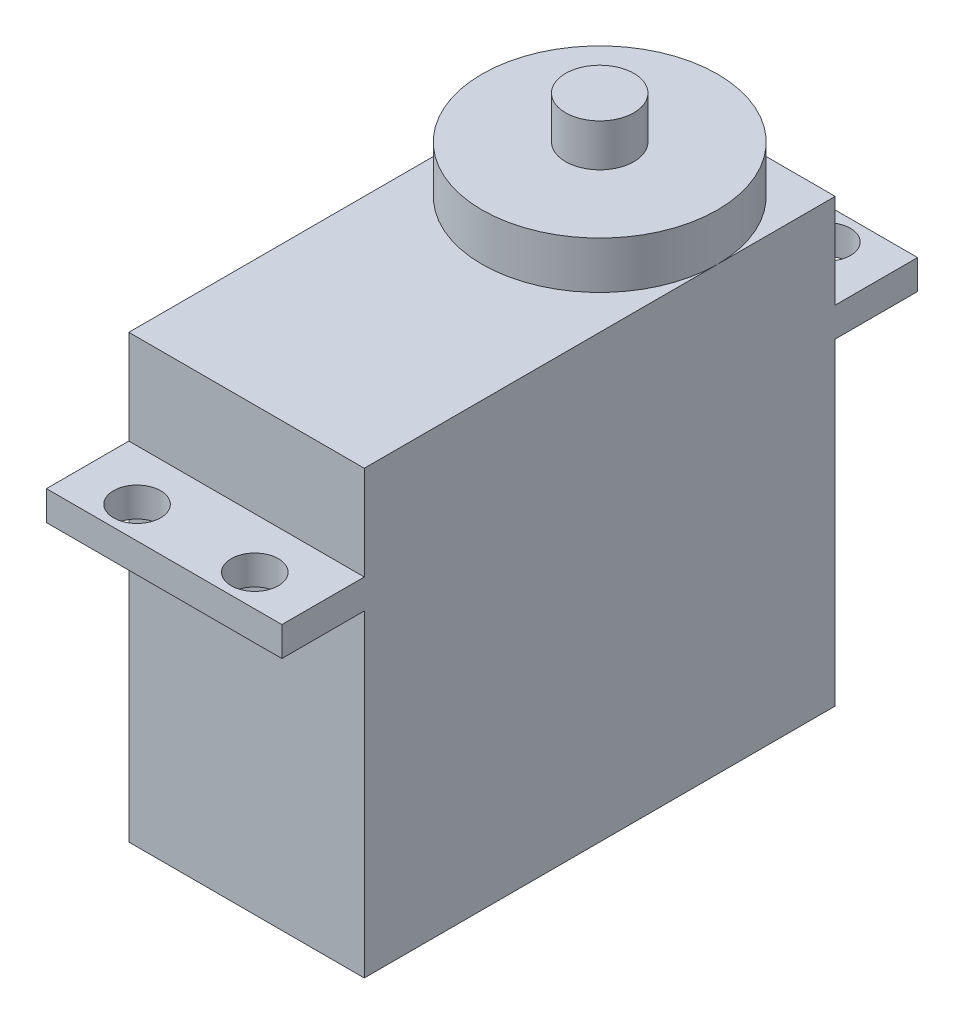
ISO-10303-21;
HEADER;
FILE_DESCRIPTION(('STEP AP214'),'2;1');
FILE_NAME('part.step','',(''),(''),'','','');
FILE_SCHEMA(('AUTOMOTIVE_DESIGN { 1 0 10303 214 1 1 1 1 }'));
ENDSEC;
DATA;
#1=APPLICATION_CONTEXT('core data for automotive mechanical design processes');
#2=APPLICATION_PROTOCOL_DEFINITION('international standard','automotive_design',2000,#1);
#3=PRODUCT_CONTEXT('',#1,'mechanical');
#4=PRODUCT('Part','Part','',(#3));
#5=PRODUCT_RELATED_PRODUCT_CATEGORY('part','',(#4));
#6=PRODUCT_DEFINITION_FORMATION('','',#4);
#7=PRODUCT_DEFINITION_CONTEXT('part definition',#1,'design');
#8=PRODUCT_DEFINITION('design','',#6,#7);
#9=PRODUCT_DEFINITION_SHAPE('','',#8);
#10=(LENGTH_UNIT() NAMED_UNIT(*) SI_UNIT(.MILLI.,.METRE.));
#11=(NAMED_UNIT(*) PLANE_ANGLE_UNIT() SI_UNIT($,.RADIAN.));
#12=(NAMED_UNIT(*) SI_UNIT($,.STERADIAN.) SOLID_ANGLE_UNIT());
#13=UNCERTAINTY_MEASURE_WITH_UNIT(LENGTH_MEASURE(1.E-05),#10,'distance_accuracy_value','');
#14=(GEOMETRIC_REPRESENTATION_CONTEXT(3) GLOBAL_UNCERTAINTY_ASSIGNED_CONTEXT((#13)) GLOBAL_UNIT_ASSIGNED_CONTEXT((#10,
#11,#12)) REPRESENTATION_CONTEXT('',''));
#15=CARTESIAN_POINT('',(0.,0.,0.));
#16=DIRECTION('',(0.,0.,1.));
#17=DIRECTION('',(1.,0.,0.));
#18=AXIS2_PLACEMENT_3D('',#15,#16,#17);
#19=CARTESIAN_POINT('',(0.,37.5,0.));
#20=DIRECTION('',(0.,1.,0.));
#21=DIRECTION('',(0.,0.,1.));
#22=AXIS2_PLACEMENT_3D('',#19,#20,#21);
#23=PLANE('',#22);
#24=CARTESIAN_POINT('',(0.,37.5,-10.));
#25=DIRECTION('',(0.,1.,0.));
#26=DIRECTION('',(0.,0.,1.));
#27=AXIS2_PLACEMENT_3D('',#24,#25,#26);
#28=CIRCLE('',#27,10.);
#29=CARTESIAN_POINT('',(10.,37.5,-10.));
#30=VERTEX_POINT('',#29);
#31=CARTESIAN_POINT('',(0.,37.5,-20.));
#32=VERTEX_POINT('',#31);
#33=EDGE_CURVE('E158',#30,#32,#28,.T.);
#34=ORIENTED_EDGE('',*,*,#33,.F.);
#35=DIRECTION('',(0.,0.,-1.));
#36=VECTOR('',#35,1.);
#37=CARTESIAN_POINT('',(10.,37.5,-20.));
#38=LINE('',#37,#36);
#39=CARTESIAN_POINT('',(10.,37.5,-20.));
#40=VERTEX_POINT('',#39);
#41=EDGE_CURVE('E146',#30,#40,#38,.T.);
#42=ORIENTED_EDGE('',*,*,#41,.T.);
#43=DIRECTION('',(-1.,0.,0.));
#44=VECTOR('',#43,1.);
#45=CARTESIAN_POINT('',(-10.,37.5,-20.));
#46=LINE('',#45,#44);
#47=EDGE_CURVE('E159',#40,#32,#46,.T.);
#48=ORIENTED_EDGE('',*,*,#47,.T.);
#49=EDGE_LOOP('',(#34,#42,#48));
#50=FACE_BOUND('',#49,.T.);
#51=ADVANCED_FACE('F39',(#50),#23,.T.);
#52=CARTESIAN_POINT('',(-10.,37.5,-10.));
#53=VERTEX_POINT('',#52);
#54=EDGE_CURVE('E48',#32,#53,#28,.T.);
#55=ORIENTED_EDGE('',*,*,#54,.F.);
#56=CARTESIAN_POINT('',(-10.,37.5,-20.));
#57=VERTEX_POINT('',#56);
#58=EDGE_CURVE('E145',#32,#57,#46,.T.);
#59=ORIENTED_EDGE('',*,*,#58,.T.);
#60=DIRECTION('',(0.,0.,1.));
#61=VECTOR('',#60,1.);
#62=CARTESIAN_POINT('',(-10.,37.5,-20.));
#63=LINE('',#62,#61);
#64=EDGE_CURVE('E198',#57,#53,#63,.T.);
#65=ORIENTED_EDGE('',*,*,#64,.T.);
#66=EDGE_LOOP('',(#55,#59,#65));
#67=FACE_BOUND('',#66,.T.);
#68=ADVANCED_FACE('F291',(#67),#23,.T.);
#69=CARTESIAN_POINT('',(0.,29.5,0.));
#70=DIRECTION('',(0.,1.,0.));
#71=DIRECTION('',(0.,0.,1.));
#72=AXIS2_PLACEMENT_3D('',#69,#70,#71);
#73=PLANE('',#72);
#74=CARTESIAN_POINT('',(5.,29.5,24.3));
#75=DIRECTION('',(0.,1.,0.));
#76=DIRECTION('',(0.,0.,1.));
#77=AXIS2_PLACEMENT_3D('',#74,#75,#76);
#78=CIRCLE('',#77,2.);
#79=CARTESIAN_POINT('',(5.,29.5,26.3));
#80=VERTEX_POINT('',#79);
#81=EDGE_CURVE('E175',#80,#80,#78,.T.);
#82=ORIENTED_EDGE('',*,*,#81,.F.);
#83=EDGE_LOOP('',(#82));
#84=FACE_BOUND('',#83,.T.);
#85=CARTESIAN_POINT('',(-5.,29.5,24.3));
#86=DIRECTION('',(0.,1.,0.));
#87=DIRECTION('',(0.,0.,1.));
#88=AXIS2_PLACEMENT_3D('',#85,#86,#87);
#89=CIRCLE('',#88,2.);
#90=CARTESIAN_POINT('',(-5.,29.5,26.3));
#91=VERTEX_POINT('',#90);
#92=EDGE_CURVE('E178',#91,#91,#89,.T.);
#93=ORIENTED_EDGE('',*,*,#92,.F.);
#94=EDGE_LOOP('',(#93));
#95=FACE_BOUND('',#94,.T.);
#96=DIRECTION('',(1.,0.,0.));
#97=VECTOR('',#96,1.);
#98=CARTESIAN_POINT('',(-10.,29.5,20.));
#99=LINE('',#98,#97);
#100=CARTESIAN_POINT('',(-10.,29.5,20.));
#101=VERTEX_POINT('',#100);
#102=CARTESIAN_POINT('',(10.,29.5,20.));
#103=VERTEX_POINT('',#102);
#104=EDGE_CURVE('E190',#101,#103,#99,.T.);
#105=ORIENTED_EDGE('',*,*,#104,.F.);
#106=DIRECTION('',(0.,0.,1.));
#107=VECTOR('',#106,1.);
#108=CARTESIAN_POINT('',(-10.,29.5,-27.));
#109=LINE('',#108,#107);
#110=CARTESIAN_POINT('',(-10.,29.5,27.));
#111=VERTEX_POINT('',#110);
#112=EDGE_CURVE('E216',#101,#111,#109,.T.);
#113=ORIENTED_EDGE('',*,*,#112,.T.);
#114=DIRECTION('',(1.,0.,0.));
#115=VECTOR('',#114,1.);
#116=CARTESIAN_POINT('',(-10.,29.5,27.));
#117=LINE('',#116,#115);
#118=CARTESIAN_POINT('',(10.,29.5,27.));
#119=VERTEX_POINT('',#118);
#120=EDGE_CURVE('E219',#111,#119,#117,.T.);
#121=ORIENTED_EDGE('',*,*,#120,.T.);
#122=DIRECTION('',(0.,0.,-1.));
#123=VECTOR('',#122,1.);
#124=CARTESIAN_POINT('',(10.,29.5,-27.));
#125=LINE('',#124,#123);
#126=EDGE_CURVE('E211',#119,#103,#125,.T.);
#127=ORIENTED_EDGE('',*,*,#126,.T.);
#128=EDGE_LOOP('',(#105,#113,#121,#127));
#129=FACE_BOUND('',#128,.T.);
#130=ADVANCED_FACE('F296',(#84,#95,#129),#73,.T.);
#131=CARTESIAN_POINT('',(10.,27.,-20.));
#132=DIRECTION('',(-1.,0.,0.));
#133=DIRECTION('',(0.,0.,1.));
#134=AXIS2_PLACEMENT_3D('',#131,#132,#133);
#135=PLANE('',#134);
#136=DIRECTION('',(0.,0.,-1.));
#137=VECTOR('',#136,1.);
#138=CARTESIAN_POINT('',(10.,0.,-20.));
#139=LINE('',#138,#137);
#140=CARTESIAN_POINT('',(10.,0.,20.));
#141=VERTEX_POINT('',#140);
#142=CARTESIAN_POINT('',(10.,0.,-20.));
#143=VERTEX_POINT('',#142);
#144=EDGE_CURVE('E244',#141,#143,#139,.T.);
#145=ORIENTED_EDGE('',*,*,#144,.T.);
#146=DIRECTION('',(0.,-1.,0.));
#147=VECTOR('',#146,1.);
#148=CARTESIAN_POINT('',(10.,27.,-20.));
#149=LINE('',#148,#147);
#150=CARTESIAN_POINT('',(10.,27.,-20.));
#151=VERTEX_POINT('',#150);
#152=EDGE_CURVE('E165',#151,#143,#149,.T.);
#153=ORIENTED_EDGE('',*,*,#152,.F.);
#154=DIRECTION('',(0.,0.,-1.));
#155=VECTOR('',#154,1.);
#156=CARTESIAN_POINT('',(10.,27.,-27.));
#157=LINE('',#156,#155);
#158=CARTESIAN_POINT('',(10.,27.,-27.));
#159=VERTEX_POINT('',#158);
#160=EDGE_CURVE('E200',#151,#159,#157,.T.);
#161=ORIENTED_EDGE('',*,*,#160,.T.);
#162=DIRECTION('',(0.,-1.,0.));
#163=VECTOR('',#162,1.);
#164=CARTESIAN_POINT('',(10.,29.5,-27.));
#165=LINE('',#164,#163);
#166=CARTESIAN_POINT('',(10.,29.5,-27.));
#167=VERTEX_POINT('',#166);
#168=EDGE_CURVE('E241',#167,#159,#165,.T.);
#169=ORIENTED_EDGE('',*,*,#168,.F.);
#170=CARTESIAN_POINT('',(10.,29.5,-20.));
#171=VERTEX_POINT('',#170);
#172=EDGE_CURVE('E214',#171,#167,#125,.T.);
#173=ORIENTED_EDGE('',*,*,#172,.F.);
#174=DIRECTION('',(0.,-1.,0.));
#175=VECTOR('',#174,1.);
#176=CARTESIAN_POINT('',(10.,119.721359549996,-20.));
#177=LINE('',#176,#175);
#178=EDGE_CURVE('E153',#40,#171,#177,.T.);
#179=ORIENTED_EDGE('',*,*,#178,.F.);
#180=ORIENTED_EDGE('',*,*,#41,.F.);
#181=CARTESIAN_POINT('',(10.,37.5,20.));
#182=VERTEX_POINT('',#181);
#183=EDGE_CURVE('E138',#182,#30,#38,.T.);
#184=ORIENTED_EDGE('',*,*,#183,.F.);
#185=DIRECTION('',(0.,-1.,0.));
#186=VECTOR('',#185,1.);
#187=CARTESIAN_POINT('',(10.,119.721359549996,20.));
#188=LINE('',#187,#186);
#189=EDGE_CURVE('E205',#182,#103,#188,.T.);
#190=ORIENTED_EDGE('',*,*,#189,.T.);
#191=ORIENTED_EDGE('',*,*,#126,.F.);
#192=DIRECTION('',(0.,-1.,0.));
#193=VECTOR('',#192,1.);
#194=CARTESIAN_POINT('',(10.,29.5,27.));
#195=LINE('',#194,#193);
#196=CARTESIAN_POINT('',(10.,27.,27.));
#197=VERTEX_POINT('',#196);
#198=EDGE_CURVE('E221',#119,#197,#195,.T.);
#199=ORIENTED_EDGE('',*,*,#198,.T.);
#200=CARTESIAN_POINT('',(10.,27.,20.));
#201=VERTEX_POINT('',#200);
#202=EDGE_CURVE('E222',#197,#201,#157,.T.);
#203=ORIENTED_EDGE('',*,*,#202,.T.);
#204=DIRECTION('',(0.,-1.,0.));
#205=VECTOR('',#204,1.);
#206=CARTESIAN_POINT('',(10.,27.,20.));
#207=LINE('',#206,#205);
#208=EDGE_CURVE('E252',#201,#141,#207,.T.);
#209=ORIENTED_EDGE('',*,*,#208,.T.);
#210=EDGE_LOOP('',(#145,#153,#161,#169,#173,#179,#180,#184,#190,#191,#199,#203,#209));
#211=FACE_BOUND('',#210,.T.);
#212=ADVANCED_FACE('F41',(#211),#135,.F.);
#213=CARTESIAN_POINT('',(-10.,27.,-20.));
#214=DIRECTION('',(0.,0.,1.));
#215=DIRECTION('',(1.,0.,0.));
#216=AXIS2_PLACEMENT_3D('',#213,#214,#215);
#217=PLANE('',#216);
#218=DIRECTION('',(-1.,0.,0.));
#219=VECTOR('',#218,1.);
#220=CARTESIAN_POINT('',(-10.,0.,-20.));
#221=LINE('',#220,#219);
#222=CARTESIAN_POINT('',(-10.,0.,-20.));
#223=VERTEX_POINT('',#222);
#224=EDGE_CURVE('E254',#143,#223,#221,.T.);
#225=ORIENTED_EDGE('',*,*,#224,.T.);
#226=DIRECTION('',(0.,-1.,0.));
#227=VECTOR('',#226,1.);
#228=CARTESIAN_POINT('',(-10.,27.,-20.));
#229=LINE('',#228,#227);
#230=CARTESIAN_POINT('',(-10.,27.,-20.));
#231=VERTEX_POINT('',#230);
#232=EDGE_CURVE('E167',#231,#223,#229,.T.);
#233=ORIENTED_EDGE('',*,*,#232,.F.);
#234=DIRECTION('',(-1.,0.,0.));
#235=VECTOR('',#234,1.);
#236=CARTESIAN_POINT('',(-10.,27.,-20.));
#237=LINE('',#236,#235);
#238=EDGE_CURVE('E245',#151,#231,#237,.T.);
#239=ORIENTED_EDGE('',*,*,#238,.F.);
#240=ORIENTED_EDGE('',*,*,#152,.T.);
#241=EDGE_LOOP('',(#225,#233,#239,#240));
#242=FACE_BOUND('',#241,.T.);
#243=ADVANCED_FACE('F337',(#242),#217,.F.);
#244=CARTESIAN_POINT('',(-10.,27.,-20.));
#245=DIRECTION('',(1.,0.,0.));
#246=DIRECTION('',(0.,0.,-1.));
#247=AXIS2_PLACEMENT_3D('',#244,#245,#246);
#248=PLANE('',#247);
#249=DIRECTION('',(0.,0.,1.));
#250=VECTOR('',#249,1.);
#251=CARTESIAN_POINT('',(-10.,0.,-20.));
#252=LINE('',#251,#250);
#253=CARTESIAN_POINT('',(-9.99999999999999,0.,20.));
#254=VERTEX_POINT('',#253);
#255=EDGE_CURVE('E256',#223,#254,#252,.T.);
#256=ORIENTED_EDGE('',*,*,#255,.T.);
#257=DIRECTION('',(0.,-1.,0.));
#258=VECTOR('',#257,1.);
#259=CARTESIAN_POINT('',(-9.99999999999999,27.,20.));
#260=LINE('',#259,#258);
#261=CARTESIAN_POINT('',(-9.99999999999999,27.,20.));
#262=VERTEX_POINT('',#261);
#263=EDGE_CURVE('E261',#262,#254,#260,.T.);
#264=ORIENTED_EDGE('',*,*,#263,.F.);
#265=DIRECTION('',(0.,0.,1.));
#266=VECTOR('',#265,1.);
#267=CARTESIAN_POINT('',(-10.,27.,-27.));
#268=LINE('',#267,#266);
#269=CARTESIAN_POINT('',(-10.,27.,27.));
#270=VERTEX_POINT('',#269);
#271=EDGE_CURVE('E227',#262,#270,#268,.T.);
#272=ORIENTED_EDGE('',*,*,#271,.T.);
#273=DIRECTION('',(0.,-1.,0.));
#274=VECTOR('',#273,1.);
#275=CARTESIAN_POINT('',(-10.,29.5,27.));
#276=LINE('',#275,#274);
#277=EDGE_CURVE('E235',#111,#270,#276,.T.);
#278=ORIENTED_EDGE('',*,*,#277,.F.);
#279=ORIENTED_EDGE('',*,*,#112,.F.);
#280=DIRECTION('',(0.,-1.,0.));
#281=VECTOR('',#280,1.);
#282=CARTESIAN_POINT('',(-10.,119.721359549996,20.));
#283=LINE('',#282,#281);
#284=CARTESIAN_POINT('',(-10.,37.5,20.));
#285=VERTEX_POINT('',#284);
#286=EDGE_CURVE('E193',#285,#101,#283,.T.);
#287=ORIENTED_EDGE('',*,*,#286,.F.);
#288=EDGE_CURVE('E201',#53,#285,#63,.T.);
#289=ORIENTED_EDGE('',*,*,#288,.F.);
#290=ORIENTED_EDGE('',*,*,#64,.F.);
#291=DIRECTION('',(0.,-1.,0.));
#292=VECTOR('',#291,1.);
#293=CARTESIAN_POINT('',(-10.,119.721359549996,-20.));
#294=LINE('',#293,#292);
#295=CARTESIAN_POINT('',(-10.,29.5,-20.));
#296=VERTEX_POINT('',#295);
#297=EDGE_CURVE('E197',#57,#296,#294,.T.);
#298=ORIENTED_EDGE('',*,*,#297,.T.);
#299=CARTESIAN_POINT('',(-10.,29.5,-27.));
#300=VERTEX_POINT('',#299);
#301=EDGE_CURVE('E217',#300,#296,#109,.T.);
#302=ORIENTED_EDGE('',*,*,#301,.F.);
#303=DIRECTION('',(0.,-1.,0.));
#304=VECTOR('',#303,1.);
#305=CARTESIAN_POINT('',(-10.,29.5,-27.));
#306=LINE('',#305,#304);
#307=CARTESIAN_POINT('',(-10.,27.,-27.));
#308=VERTEX_POINT('',#307);
#309=EDGE_CURVE('E238',#300,#308,#306,.T.);
#310=ORIENTED_EDGE('',*,*,#309,.T.);
#311=EDGE_CURVE('E228',#308,#231,#268,.T.);
#312=ORIENTED_EDGE('',*,*,#311,.T.);
#313=ORIENTED_EDGE('',*,*,#232,.T.);
#314=EDGE_LOOP('',(#256,#264,#272,#278,#279,#287,#289,#290,#298,#302,#310,#312,#313));
#315=FACE_BOUND('',#314,.T.);
#316=ADVANCED_FACE('F340',(#315),#248,.F.);
#317=CARTESIAN_POINT('',(-9.99999999999999,27.,20.));
#318=DIRECTION('',(0.,0.,-1.));
#319=DIRECTION('',(-1.,0.,0.));
#320=AXIS2_PLACEMENT_3D('',#317,#318,#319);
#321=PLANE('',#320);
#322=DIRECTION('',(1.,0.,0.));
#323=VECTOR('',#322,1.);
#324=CARTESIAN_POINT('',(-9.99999999999999,0.,20.));
#325=LINE('',#324,#323);
#326=EDGE_CURVE('E249',#254,#141,#325,.T.);
#327=ORIENTED_EDGE('',*,*,#326,.T.);
#328=ORIENTED_EDGE('',*,*,#208,.F.);
#329=DIRECTION('',(1.,0.,0.));
#330=VECTOR('',#329,1.);
#331=CARTESIAN_POINT('',(-9.99999999999999,27.,20.));
#332=LINE('',#331,#330);
#333=EDGE_CURVE('E248',#262,#201,#332,.T.);
#334=ORIENTED_EDGE('',*,*,#333,.F.);
#335=ORIENTED_EDGE('',*,*,#263,.T.);
#336=EDGE_LOOP('',(#327,#328,#334,#335));
#337=FACE_BOUND('',#336,.T.);
#338=ADVANCED_FACE('F344',(#337),#321,.F.);
#339=CARTESIAN_POINT('',(0.,0.,0.));
#340=DIRECTION('',(0.,1.,0.));
#341=DIRECTION('',(0.,0.,1.));
#342=AXIS2_PLACEMENT_3D('',#339,#340,#341);
#343=PLANE('',#342);
#344=ORIENTED_EDGE('',*,*,#144,.F.);
#345=ORIENTED_EDGE('',*,*,#326,.F.);
#346=ORIENTED_EDGE('',*,*,#255,.F.);
#347=ORIENTED_EDGE('',*,*,#224,.F.);
#348=EDGE_LOOP('',(#344,#345,#346,#347));
#349=FACE_BOUND('',#348,.T.);
#350=ADVANCED_FACE('F326',(#349),#343,.F.);
#351=CARTESIAN_POINT('',(0.,27.,0.));
#352=DIRECTION('',(0.,1.,0.));
#353=DIRECTION('',(0.,0.,1.));
#354=AXIS2_PLACEMENT_3D('',#351,#352,#353);
#355=PLANE('',#354);
#356=CARTESIAN_POINT('',(-5.,27.,-24.3));
#357=DIRECTION('',(0.,1.,0.));
#358=DIRECTION('',(0.,0.,1.));
#359=AXIS2_PLACEMENT_3D('',#356,#357,#358);
#360=CIRCLE('',#359,2.);
#361=CARTESIAN_POINT('',(-5.,27.,-22.3));
#362=VERTEX_POINT('',#361);
#363=EDGE_CURVE('E186',#362,#362,#360,.T.);
#364=ORIENTED_EDGE('',*,*,#363,.T.);
#365=EDGE_LOOP('',(#364));
#366=FACE_BOUND('',#365,.T.);
#367=CARTESIAN_POINT('',(5.,27.,-24.3));
#368=DIRECTION('',(0.,1.,0.));
#369=DIRECTION('',(0.,0.,1.));
#370=AXIS2_PLACEMENT_3D('',#367,#368,#369);
#371=CIRCLE('',#370,2.);
#372=CARTESIAN_POINT('',(5.,27.,-22.3));
#373=VERTEX_POINT('',#372);
#374=EDGE_CURVE('E183',#373,#373,#371,.T.);
#375=ORIENTED_EDGE('',*,*,#374,.T.);
#376=EDGE_LOOP('',(#375));
#377=FACE_BOUND('',#376,.T.);
#378=ORIENTED_EDGE('',*,*,#160,.F.);
#379=ORIENTED_EDGE('',*,*,#238,.T.);
#380=ORIENTED_EDGE('',*,*,#311,.F.);
#381=DIRECTION('',(-1.,0.,0.));
#382=VECTOR('',#381,1.);
#383=CARTESIAN_POINT('',(-10.,27.,-27.));
#384=LINE('',#383,#382);
#385=EDGE_CURVE('E225',#159,#308,#384,.T.);
#386=ORIENTED_EDGE('',*,*,#385,.F.);
#387=EDGE_LOOP('',(#378,#379,#380,#386));
#388=FACE_BOUND('',#387,.T.);
#389=ADVANCED_FACE('F323',(#366,#377,#388),#355,.F.);
#390=CARTESIAN_POINT('',(5.,27.,24.3));
#391=DIRECTION('',(0.,1.,0.));
#392=DIRECTION('',(0.,0.,1.));
#393=AXIS2_PLACEMENT_3D('',#390,#391,#392);
#394=CIRCLE('',#393,2.);
#395=CARTESIAN_POINT('',(5.,27.,26.3));
#396=VERTEX_POINT('',#395);
#397=EDGE_CURVE('E43',#396,#396,#394,.T.);
#398=ORIENTED_EDGE('',*,*,#397,.T.);
#399=EDGE_LOOP('',(#398));
#400=FACE_BOUND('',#399,.T.);
#401=CARTESIAN_POINT('',(-5.,27.,24.3));
#402=DIRECTION('',(0.,1.,0.));
#403=DIRECTION('',(0.,0.,1.));
#404=AXIS2_PLACEMENT_3D('',#401,#402,#403);
#405=CIRCLE('',#404,2.);
#406=CARTESIAN_POINT('',(-5.,27.,26.3));
#407=VERTEX_POINT('',#406);
#408=EDGE_CURVE('E189',#407,#407,#405,.T.);
#409=ORIENTED_EDGE('',*,*,#408,.T.);
#410=EDGE_LOOP('',(#409));
#411=FACE_BOUND('',#410,.T.);
#412=ORIENTED_EDGE('',*,*,#271,.F.);
#413=ORIENTED_EDGE('',*,*,#333,.T.);
#414=ORIENTED_EDGE('',*,*,#202,.F.);
#415=DIRECTION('',(1.,0.,0.));
#416=VECTOR('',#415,1.);
#417=CARTESIAN_POINT('',(-10.,27.,27.));
#418=LINE('',#417,#416);
#419=EDGE_CURVE('E231',#270,#197,#418,.T.);
#420=ORIENTED_EDGE('',*,*,#419,.F.);
#421=EDGE_LOOP('',(#412,#413,#414,#420));
#422=FACE_BOUND('',#421,.T.);
#423=ADVANCED_FACE('F271',(#400,#411,#422),#355,.F.);
#424=CARTESIAN_POINT('',(-10.,29.5,-27.));
#425=DIRECTION('',(0.,0.,1.));
#426=DIRECTION('',(1.,0.,0.));
#427=AXIS2_PLACEMENT_3D('',#424,#425,#426);
#428=PLANE('',#427);
#429=ORIENTED_EDGE('',*,*,#385,.T.);
#430=ORIENTED_EDGE('',*,*,#309,.F.);
#431=DIRECTION('',(-1.,0.,0.));
#432=VECTOR('',#431,1.);
#433=CARTESIAN_POINT('',(-10.,29.5,-27.));
#434=LINE('',#433,#432);
#435=EDGE_CURVE('E213',#167,#300,#434,.T.);
#436=ORIENTED_EDGE('',*,*,#435,.F.);
#437=ORIENTED_EDGE('',*,*,#168,.T.);
#438=EDGE_LOOP('',(#429,#430,#436,#437));
#439=FACE_BOUND('',#438,.T.);
#440=ADVANCED_FACE('F366',(#439),#428,.F.);
#441=CARTESIAN_POINT('',(-10.,29.5,27.));
#442=DIRECTION('',(0.,0.,-1.));
#443=DIRECTION('',(-1.,0.,0.));
#444=AXIS2_PLACEMENT_3D('',#441,#442,#443);
#445=PLANE('',#444);
#446=ORIENTED_EDGE('',*,*,#419,.T.);
#447=ORIENTED_EDGE('',*,*,#198,.F.);
#448=ORIENTED_EDGE('',*,*,#120,.F.);
#449=ORIENTED_EDGE('',*,*,#277,.T.);
#450=EDGE_LOOP('',(#446,#447,#448,#449));
#451=FACE_BOUND('',#450,.T.);
#452=ADVANCED_FACE('F356',(#451),#445,.F.);
#453=CARTESIAN_POINT('',(-5.,29.5,-24.3));
#454=DIRECTION('',(0.,1.,0.));
#455=DIRECTION('',(0.,0.,1.));
#456=AXIS2_PLACEMENT_3D('',#453,#454,#455);
#457=CIRCLE('',#456,2.);
#458=CARTESIAN_POINT('',(-5.,29.5,-22.3));
#459=VERTEX_POINT('',#458);
#460=EDGE_CURVE('E174',#459,#459,#457,.T.);
#461=ORIENTED_EDGE('',*,*,#460,.F.);
#462=EDGE_LOOP('',(#461));
#463=FACE_BOUND('',#462,.T.);
#464=CARTESIAN_POINT('',(5.,29.5,-24.3));
#465=DIRECTION('',(0.,1.,0.));
#466=DIRECTION('',(0.,0.,1.));
#467=AXIS2_PLACEMENT_3D('',#464,#465,#466);
#468=CIRCLE('',#467,2.);
#469=CARTESIAN_POINT('',(5.,29.5,-22.3));
#470=VERTEX_POINT('',#469);
#471=EDGE_CURVE('E171',#470,#470,#468,.T.);
#472=ORIENTED_EDGE('',*,*,#471,.F.);
#473=EDGE_LOOP('',(#472));
#474=FACE_BOUND('',#473,.T.);
#475=DIRECTION('',(-1.,0.,0.));
#476=VECTOR('',#475,1.);
#477=CARTESIAN_POINT('',(-10.,29.5,-20.));
#478=LINE('',#477,#476);
#479=EDGE_CURVE('E194',#171,#296,#478,.T.);
#480=ORIENTED_EDGE('',*,*,#479,.F.);
#481=ORIENTED_EDGE('',*,*,#172,.T.);
#482=ORIENTED_EDGE('',*,*,#435,.T.);
#483=ORIENTED_EDGE('',*,*,#301,.T.);
#484=EDGE_LOOP('',(#480,#481,#482,#483));
#485=FACE_BOUND('',#484,.T.);
#486=ADVANCED_FACE('F313',(#463,#474,#485),#73,.T.);
#487=CARTESIAN_POINT('',(-10.,119.721359549996,-20.));
#488=DIRECTION('',(0.,0.,1.));
#489=DIRECTION('',(1.,0.,0.));
#490=AXIS2_PLACEMENT_3D('',#487,#488,#489);
#491=PLANE('',#490);
#492=ORIENTED_EDGE('',*,*,#47,.F.);
#493=ORIENTED_EDGE('',*,*,#178,.T.);
#494=ORIENTED_EDGE('',*,*,#479,.T.);
#495=ORIENTED_EDGE('',*,*,#297,.F.);
#496=ORIENTED_EDGE('',*,*,#58,.F.);
#497=EDGE_LOOP('',(#492,#493,#494,#495,#496));
#498=FACE_BOUND('',#497,.T.);
#499=ADVANCED_FACE('F307',(#498),#491,.F.);
#500=CARTESIAN_POINT('',(-10.,119.721359549996,20.));
#501=DIRECTION('',(0.,0.,-1.));
#502=DIRECTION('',(-1.,0.,0.));
#503=AXIS2_PLACEMENT_3D('',#500,#501,#502);
#504=PLANE('',#503);
#505=DIRECTION('',(1.,0.,0.));
#506=VECTOR('',#505,1.);
#507=CARTESIAN_POINT('',(-10.,37.5,20.));
#508=LINE('',#507,#506);
#509=EDGE_CURVE('E142',#285,#182,#508,.T.);
#510=ORIENTED_EDGE('',*,*,#509,.F.);
#511=ORIENTED_EDGE('',*,*,#286,.T.);
#512=ORIENTED_EDGE('',*,*,#104,.T.);
#513=ORIENTED_EDGE('',*,*,#189,.F.);
#514=EDGE_LOOP('',(#510,#511,#512,#513));
#515=FACE_BOUND('',#514,.T.);
#516=ADVANCED_FACE('F301',(#515),#504,.F.);
#517=EDGE_CURVE('E56',#53,#30,#28,.T.);
#518=ORIENTED_EDGE('',*,*,#517,.F.);
#519=ORIENTED_EDGE('',*,*,#288,.T.);
#520=ORIENTED_EDGE('',*,*,#509,.T.);
#521=ORIENTED_EDGE('',*,*,#183,.T.);
#522=EDGE_LOOP('',(#518,#519,#520,#521));
#523=FACE_BOUND('',#522,.T.);
#524=ADVANCED_FACE('F140',(#523),#23,.T.);
#525=CARTESIAN_POINT('',(5.,0.,-24.3));
#526=DIRECTION('',(0.,1.,0.));
#527=DIRECTION('',(0.,0.,1.));
#528=AXIS2_PLACEMENT_3D('',#525,#526,#527);
#529=CYLINDRICAL_SURFACE('',#528,2.);
#530=ORIENTED_EDGE('',*,*,#471,.T.);
#531=EDGE_LOOP('',(#530));
#532=FACE_BOUND('',#531,.T.);
#533=ORIENTED_EDGE('',*,*,#374,.F.);
#534=EDGE_LOOP('',(#533));
#535=FACE_BOUND('',#534,.T.);
#536=ADVANCED_FACE('F300',(#532,#535),#529,.F.);
#537=CARTESIAN_POINT('',(-5.,0.,-24.3));
#538=DIRECTION('',(0.,1.,0.));
#539=DIRECTION('',(0.,0.,1.));
#540=AXIS2_PLACEMENT_3D('',#537,#538,#539);
#541=CYLINDRICAL_SURFACE('',#540,2.);
#542=ORIENTED_EDGE('',*,*,#460,.T.);
#543=EDGE_LOOP('',(#542));
#544=FACE_BOUND('',#543,.T.);
#545=ORIENTED_EDGE('',*,*,#363,.F.);
#546=EDGE_LOOP('',(#545));
#547=FACE_BOUND('',#546,.T.);
#548=ADVANCED_FACE('F285',(#544,#547),#541,.F.);
#549=CARTESIAN_POINT('',(-5.,0.,24.3));
#550=DIRECTION('',(0.,1.,0.));
#551=DIRECTION('',(0.,0.,1.));
#552=AXIS2_PLACEMENT_3D('',#549,#550,#551);
#553=CYLINDRICAL_SURFACE('',#552,2.);
#554=ORIENTED_EDGE('',*,*,#92,.T.);
#555=EDGE_LOOP('',(#554));
#556=FACE_BOUND('',#555,.T.);
#557=ORIENTED_EDGE('',*,*,#408,.F.);
#558=EDGE_LOOP('',(#557));
#559=FACE_BOUND('',#558,.T.);
#560=ADVANCED_FACE('F275',(#556,#559),#553,.F.);
#561=CARTESIAN_POINT('',(5.,0.,24.3));
#562=DIRECTION('',(0.,1.,0.));
#563=DIRECTION('',(0.,0.,1.));
#564=AXIS2_PLACEMENT_3D('',#561,#562,#563);
#565=CYLINDRICAL_SURFACE('',#564,2.);
#566=ORIENTED_EDGE('',*,*,#81,.T.);
#567=EDGE_LOOP('',(#566));
#568=FACE_BOUND('',#567,.T.);
#569=ORIENTED_EDGE('',*,*,#397,.F.);
#570=EDGE_LOOP('',(#569));
#571=FACE_BOUND('',#570,.T.);
#572=ADVANCED_FACE('F273',(#568,#571),#565,.F.);
#573=CARTESIAN_POINT('',(0.,41.5,-10.));
#574=DIRECTION('',(0.,-1.,0.));
#575=DIRECTION('',(0.,0.,-1.));
#576=AXIS2_PLACEMENT_3D('',#573,#574,#575);
#577=CYLINDRICAL_SURFACE('',#576,10.);
#578=CARTESIAN_POINT('',(0.,41.5,-10.));
#579=DIRECTION('',(0.,1.,0.));
#580=DIRECTION('',(0.,0.,1.));
#581=AXIS2_PLACEMENT_3D('',#578,#579,#580);
#582=CIRCLE('',#581,10.);
#583=CARTESIAN_POINT('',(0.,41.5,0.));
#584=VERTEX_POINT('',#583);
#585=EDGE_CURVE('E161',#584,#584,#582,.T.);
#586=ORIENTED_EDGE('',*,*,#585,.F.);
#587=EDGE_LOOP('',(#586));
#588=FACE_BOUND('',#587,.T.);
#589=ORIENTED_EDGE('',*,*,#33,.T.);
#590=ORIENTED_EDGE('',*,*,#54,.T.);
#591=ORIENTED_EDGE('',*,*,#517,.T.);
#592=EDGE_LOOP('',(#589,#590,#591));
#593=FACE_BOUND('',#592,.T.);
#594=ADVANCED_FACE('F164',(#588,#593),#577,.T.);
#595=CARTESIAN_POINT('',(0.,41.5,-10.));
#596=DIRECTION('',(0.,1.,0.));
#597=DIRECTION('',(0.,0.,1.));
#598=AXIS2_PLACEMENT_3D('',#595,#596,#597);
#599=PLANE('',#598);
#600=CARTESIAN_POINT('',(0.,41.5,-10.));
#601=DIRECTION('',(0.,1.,0.));
#602=DIRECTION('',(0.,0.,1.));
#603=AXIS2_PLACEMENT_3D('',#600,#601,#602);
#604=CIRCLE('',#603,2.9);
#605=CARTESIAN_POINT('',(0.,41.5,-7.1));
#606=VERTEX_POINT('',#605);
#607=EDGE_CURVE('E12',#606,#606,#604,.T.);
#608=ORIENTED_EDGE('',*,*,#607,.F.);
#609=EDGE_LOOP('',(#608));
#610=FACE_BOUND('',#609,.T.);
#611=ORIENTED_EDGE('',*,*,#585,.T.);
#612=EDGE_LOOP('',(#611));
#613=FACE_BOUND('',#612,.T.);
#614=ADVANCED_FACE('F282',(#610,#613),#599,.T.);
#615=CARTESIAN_POINT('',(0.,45.1,-10.));
#616=DIRECTION('',(0.,-1.,0.));
#617=DIRECTION('',(0.,0.,-1.));
#618=AXIS2_PLACEMENT_3D('',#615,#616,#617);
#619=CYLINDRICAL_SURFACE('',#618,2.9);
#620=CARTESIAN_POINT('',(0.,45.1,-10.));
#621=DIRECTION('',(0.,1.,0.));
#622=DIRECTION('',(0.,0.,1.));
#623=AXIS2_PLACEMENT_3D('',#620,#621,#622);
#624=CIRCLE('',#623,2.9);
#625=CARTESIAN_POINT('',(0.,45.1,-7.1));
#626=VERTEX_POINT('',#625);
#627=EDGE_CURVE('E162',#626,#626,#624,.T.);
#628=ORIENTED_EDGE('',*,*,#627,.F.);
#629=EDGE_LOOP('',(#628));
#630=FACE_BOUND('',#629,.T.);
#631=ORIENTED_EDGE('',*,*,#607,.T.);
#632=EDGE_LOOP('',(#631));
#633=FACE_BOUND('',#632,.T.);
#634=ADVANCED_FACE('F432',(#630,#633),#619,.T.);
#635=CARTESIAN_POINT('',(0.,45.1,-10.));
#636=DIRECTION('',(0.,1.,0.));
#637=DIRECTION('',(0.,0.,1.));
#638=AXIS2_PLACEMENT_3D('',#635,#636,#637);
#639=PLANE('',#638);
#640=ORIENTED_EDGE('',*,*,#627,.T.);
#641=EDGE_LOOP('',(#640));
#642=FACE_BOUND('',#641,.T.);
#643=ADVANCED_FACE('F442',(#642),#639,.T.);
#644=CLOSED_SHELL('',(#51,#68,#130,#212,#243,#316,#338,#350,#389,#423,#440,#452,#486,#499,#516,
#524,#536,#548,#560,#572,#594,#614,#634,#643));
#645=MANIFOLD_SOLID_BREP('B2',#644);
#646=ADVANCED_BREP_SHAPE_REPRESENTATION('',(#18,#645),#14);
#647=SHAPE_DEFINITION_REPRESENTATION(#9,#646);
ENDSEC;
END-ISO-10303-21;
